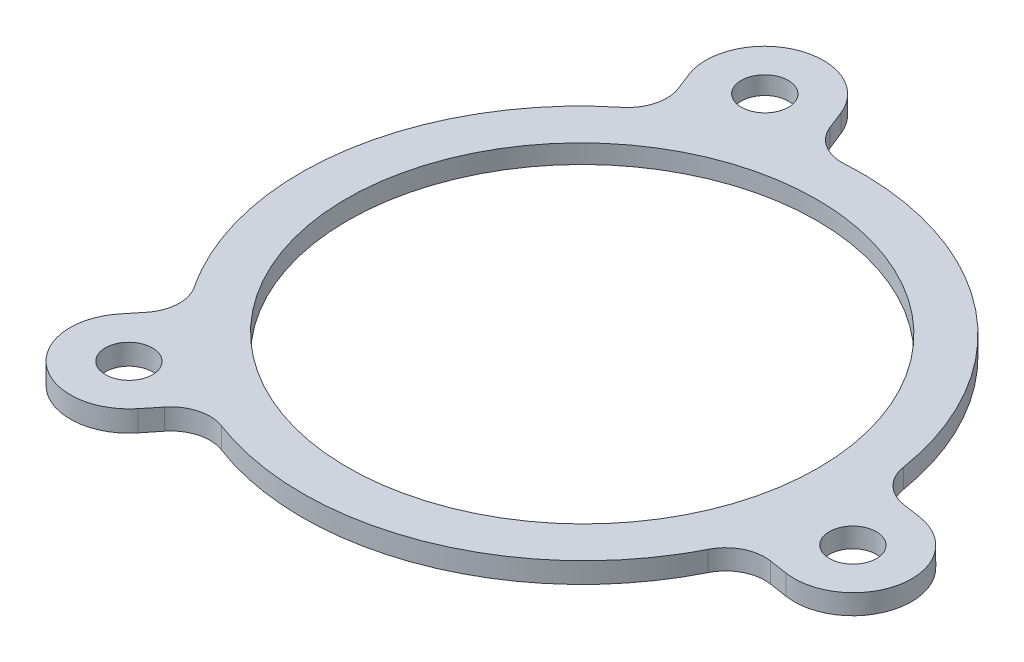
ISO-10303-21;
HEADER;
FILE_DESCRIPTION(('STEP AP214'),'2;1');
FILE_NAME('part.step','',(''),(''),'','','');
FILE_SCHEMA(('AUTOMOTIVE_DESIGN { 1 0 10303 214 1 1 1 1 }'));
ENDSEC;
DATA;
#1=APPLICATION_CONTEXT('core data for automotive mechanical design processes');
#2=APPLICATION_PROTOCOL_DEFINITION('international standard','automotive_design',2000,#1);
#3=PRODUCT_CONTEXT('',#1,'mechanical');
#4=PRODUCT('Part','Part','',(#3));
#5=PRODUCT_RELATED_PRODUCT_CATEGORY('part','',(#4));
#6=PRODUCT_DEFINITION_FORMATION('','',#4);
#7=PRODUCT_DEFINITION_CONTEXT('part definition',#1,'design');
#8=PRODUCT_DEFINITION('design','',#6,#7);
#9=PRODUCT_DEFINITION_SHAPE('','',#8);
#10=(LENGTH_UNIT() NAMED_UNIT(*) SI_UNIT(.MILLI.,.METRE.));
#11=(NAMED_UNIT(*) PLANE_ANGLE_UNIT() SI_UNIT($,.RADIAN.));
#12=(NAMED_UNIT(*) SI_UNIT($,.STERADIAN.) SOLID_ANGLE_UNIT());
#13=UNCERTAINTY_MEASURE_WITH_UNIT(LENGTH_MEASURE(1.E-05),#10,'distance_accuracy_value','');
#14=(GEOMETRIC_REPRESENTATION_CONTEXT(3) GLOBAL_UNCERTAINTY_ASSIGNED_CONTEXT((#13)) GLOBAL_UNIT_ASSIGNED_CONTEXT((#10,
#11,#12)) REPRESENTATION_CONTEXT('',''));
#15=CARTESIAN_POINT('',(0.,0.,0.));
#16=DIRECTION('',(0.,0.,1.));
#17=DIRECTION('',(1.,0.,0.));
#18=AXIS2_PLACEMENT_3D('',#15,#16,#17);
#19=CARTESIAN_POINT('',(-6.0204669415708,49.0014439556006,-15.3624209617317));
#20=DIRECTION('',(0.,-1.,0.));
#21=DIRECTION('',(0.,0.,-1.));
#22=AXIS2_PLACEMENT_3D('',#19,#20,#21);
#23=CYLINDRICAL_SURFACE('',#22,1.2);
#24=CARTESIAN_POINT('',(-6.0204669415708,0.,-15.3624209617317));
#25=DIRECTION('',(0.,1.,0.));
#26=DIRECTION('',(0.,0.,1.));
#27=AXIS2_PLACEMENT_3D('',#24,#25,#26);
#28=CIRCLE('',#27,1.2);
#29=CARTESIAN_POINT('',(-6.0204669415708,0.,-14.1624209617317));
#30=VERTEX_POINT('',#29);
#31=EDGE_CURVE('E740',#30,#30,#28,.T.);
#32=ORIENTED_EDGE('',*,*,#31,.F.);
#33=EDGE_LOOP('',(#32));
#34=FACE_BOUND('',#33,.T.);
#35=CARTESIAN_POINT('',(-6.0204669415708,0.922243136209582,-15.3624209617317));
#36=DIRECTION('',(0.,0.999987190864844,-0.0050614332197987));
#37=DIRECTION('',(0.,-0.0050614332197987,-0.999987190864844));
#38=AXIS2_PLACEMENT_3D('',#35,#36,#37);
#39=ELLIPSE('',#38,1.20001537115908,1.2);
#40=CARTESIAN_POINT('',(-6.0204669415708,0.916169338545728,-16.5624209617317));
#41=VERTEX_POINT('',#40);
#42=EDGE_CURVE('E194',#41,#41,#39,.T.);
#43=ORIENTED_EDGE('',*,*,#42,.T.);
#44=EDGE_LOOP('',(#43));
#45=FACE_BOUND('',#44,.T.);
#46=ADVANCED_FACE('F43',(#34,#45),#23,.F.);
#47=CARTESIAN_POINT('',(-3.22729949398321,49.0014439556006,-16.4570513147446));
#48=DIRECTION('',(-0.931055815862527,0.,0.364876784337624));
#49=DIRECTION('',(0.364876784337624,0.,0.931055815862527));
#50=AXIS2_PLACEMENT_3D('',#47,#48,#49);
#51=PLANE('',#50);
#52=DIRECTION('',(-0.364872732812042,-0.00471248487226164,-0.93104547758775));
#53=VECTOR('',#52,1.);
#54=CARTESIAN_POINT('',(-3.14461983774469,0.917770509358373,-16.2460776981739));
#55=LINE('',#54,#53);
#56=CARTESIAN_POINT('',(-2.87443070108355,0.921260115746203,-15.5566362815929));
#57=VERTEX_POINT('',#56);
#58=CARTESIAN_POINT('',(-3.22729949398321,0.916702666808822,-16.4570513147446));
#59=VERTEX_POINT('',#58);
#60=EDGE_CURVE('E173',#57,#59,#55,.T.);
#61=ORIENTED_EDGE('',*,*,#60,.F.);
#62=DIRECTION('',(0.,-1.,0.));
#63=VECTOR('',#62,1.);
#64=CARTESIAN_POINT('',(-2.87443070108355,49.0014439556006,-15.5566362815929));
#65=LINE('',#64,#63);
#66=CARTESIAN_POINT('',(-2.87443070108355,0.,-15.5566362815929));
#67=VERTEX_POINT('',#66);
#68=EDGE_CURVE('E60',#57,#67,#65,.T.);
#69=ORIENTED_EDGE('',*,*,#68,.T.);
#70=DIRECTION('',(-0.364876784337624,0.,-0.931055815862527));
#71=VECTOR('',#70,1.);
#72=CARTESIAN_POINT('',(-3.22729949398321,0.,-16.4570513147446));
#73=LINE('',#72,#71);
#74=CARTESIAN_POINT('',(-3.22729949398321,0.,-16.4570513147446));
#75=VERTEX_POINT('',#74);
#76=EDGE_CURVE('E176',#67,#75,#73,.T.);
#77=ORIENTED_EDGE('',*,*,#76,.T.);
#78=DIRECTION('',(0.,-1.,0.));
#79=VECTOR('',#78,1.);
#80=CARTESIAN_POINT('',(-3.22729949398321,49.0014439556006,-16.4570513147446));
#81=LINE('',#80,#79);
#82=EDGE_CURVE('E169',#59,#75,#81,.T.);
#83=ORIENTED_EDGE('',*,*,#82,.F.);
#84=EDGE_LOOP('',(#61,#69,#77,#83));
#85=FACE_BOUND('',#84,.T.);
#86=ADVANCED_FACE('F171',(#85),#51,.F.);
#87=CARTESIAN_POINT('',(-1.0123190693585,49.0014439556006,-16.2863898502682));
#88=DIRECTION('',(0.,-1.,0.));
#89=DIRECTION('',(0.,0.,-1.));
#90=AXIS2_PLACEMENT_3D('',#87,#88,#89);
#91=CYLINDRICAL_SURFACE('',#90,2.);
#92=CARTESIAN_POINT('',(-1.0123190693585,0.917566469479027,-16.2863898502682));
#93=DIRECTION('',(0.,0.999987190864844,-0.0050614332197987));
#94=DIRECTION('',(0.,-0.0050614332197987,-0.999987190864844));
#95=AXIS2_PLACEMENT_3D('',#92,#93,#94);
#96=ELLIPSE('',#95,2.00002561859846,2.);
#97=CARTESIAN_POINT('',(-0.888243794181388,0.927669966778247,-14.2902422289511));
#98=VERTEX_POINT('',#97);
#99=EDGE_CURVE('E188',#98,#57,#96,.F.);
#100=ORIENTED_EDGE('',*,*,#99,.F.);
#101=DIRECTION('',(0.,-1.,0.));
#102=VECTOR('',#101,1.);
#103=CARTESIAN_POINT('',(-0.888243794181388,49.0014439556006,-14.2902422289511));
#104=LINE('',#103,#102);
#105=CARTESIAN_POINT('',(-0.888243794181388,0.,-14.2902422289511));
#106=VERTEX_POINT('',#105);
#107=EDGE_CURVE('E296',#98,#106,#104,.T.);
#108=ORIENTED_EDGE('',*,*,#107,.T.);
#109=CARTESIAN_POINT('',(-1.0123190693585,0.,-16.2863898502682));
#110=DIRECTION('',(0.,-1.,0.));
#111=DIRECTION('',(0.,0.,-1.));
#112=AXIS2_PLACEMENT_3D('',#109,#110,#111);
#113=CIRCLE('',#112,2.);
#114=EDGE_CURVE('E291',#106,#67,#113,.T.);
#115=ORIENTED_EDGE('',*,*,#114,.T.);
#116=ORIENTED_EDGE('',*,*,#68,.F.);
#117=EDGE_LOOP('',(#100,#108,#115,#116));
#118=FACE_BOUND('',#117,.T.);
#119=ADVANCED_FACE('F423',(#118),#91,.F.);
#120=CARTESIAN_POINT('',(0.,49.0014439556006,0.));
#121=DIRECTION('',(0.,-1.,0.));
#122=DIRECTION('',(0.,0.,-1.));
#123=AXIS2_PLACEMENT_3D('',#120,#121,#122);
#124=CYLINDRICAL_SURFACE('',#123,14.3178210632764);
#125=CARTESIAN_POINT('',(0.,1.,0.));
#126=DIRECTION('',(0.,0.999987190864844,-0.0050614332197987));
#127=DIRECTION('',(0.,-0.0050614332197987,-0.999987190864844));
#128=AXIS2_PLACEMENT_3D('',#125,#126,#127);
#129=ELLIPSE('',#128,14.3180044645307,14.3178210632764);
#130=CARTESIAN_POINT('',(14.1319095605525,0.9883595094098,-2.29981133408054));
#131=VERTEX_POINT('',#130);
#132=EDGE_CURVE('E191',#131,#98,#129,.T.);
#133=ORIENTED_EDGE('',*,*,#132,.F.);
#134=DIRECTION('',(0.,-1.,0.));
#135=VECTOR('',#134,1.);
#136=CARTESIAN_POINT('',(14.1319095605525,49.0014439556006,-2.29981133408054));
#137=LINE('',#136,#135);
#138=CARTESIAN_POINT('',(14.1319095605525,0.,-2.29981133408054));
#139=VERTEX_POINT('',#138);
#140=EDGE_CURVE('E298',#131,#139,#137,.T.);
#141=ORIENTED_EDGE('',*,*,#140,.T.);
#142=CARTESIAN_POINT('',(0.,0.,0.));
#143=DIRECTION('',(0.,1.,0.));
#144=DIRECTION('',(0.,0.,-1.));
#145=AXIS2_PLACEMENT_3D('',#142,#143,#144);
#146=CIRCLE('',#145,14.3178210632764);
#147=EDGE_CURVE('E414',#139,#106,#146,.T.);
#148=ORIENTED_EDGE('',*,*,#147,.T.);
#149=ORIENTED_EDGE('',*,*,#107,.F.);
#150=EDGE_LOOP('',(#133,#141,#148,#149));
#151=FACE_BOUND('',#150,.T.);
#152=ADVANCED_FACE('F424',(#151),#124,.T.);
#153=CARTESIAN_POINT('',(16.1059403153856,49.0014439556006,-2.62106291613576));
#154=DIRECTION('',(0.,-1.,0.));
#155=DIRECTION('',(0.,0.,-1.));
#156=AXIS2_PLACEMENT_3D('',#153,#154,#155);
#157=CYLINDRICAL_SURFACE('',#156,2.);
#158=CARTESIAN_POINT('',(16.1059403153856,0.986733495152638,-2.62106291613576));
#159=DIRECTION('',(0.,0.999987190864844,-0.0050614332197987));
#160=DIRECTION('',(0.,-0.0050614332197987,-0.999987190864844));
#161=AXIS2_PLACEMENT_3D('',#158,#159,#160);
#162=ELLIPSE('',#161,2.00002561859847,2.);
#163=CARTESIAN_POINT('',(15.8068696284982,0.996742672148186,-0.643550154041748));
#164=VERTEX_POINT('',#163);
#165=EDGE_CURVE('E396',#164,#131,#162,.F.);
#166=ORIENTED_EDGE('',*,*,#165,.F.);
#167=DIRECTION('',(0.,-1.,0.));
#168=VECTOR('',#167,1.);
#169=CARTESIAN_POINT('',(15.8068696284982,49.0014439556006,-0.643550154041748));
#170=LINE('',#169,#168);
#171=CARTESIAN_POINT('',(15.8068696284982,0.,-0.643550154041748));
#172=VERTEX_POINT('',#171);
#173=EDGE_CURVE('E300',#164,#172,#170,.T.);
#174=ORIENTED_EDGE('',*,*,#173,.T.);
#175=CARTESIAN_POINT('',(16.1059403153856,0.,-2.62106291613576));
#176=DIRECTION('',(0.,-1.,0.));
#177=DIRECTION('',(0.,0.,-1.));
#178=AXIS2_PLACEMENT_3D('',#175,#176,#177);
#179=CIRCLE('',#178,2.);
#180=EDGE_CURVE('E413',#172,#139,#179,.T.);
#181=ORIENTED_EDGE('',*,*,#180,.T.);
#182=ORIENTED_EDGE('',*,*,#140,.F.);
#183=EDGE_LOOP('',(#166,#174,#181,#182));
#184=FACE_BOUND('',#183,.T.);
#185=ADVANCED_FACE('F425',(#184),#157,.F.);
#186=CARTESIAN_POINT('',(16.7630863176067,49.0014439556006,-0.498935976319788));
#187=DIRECTION('',(-0.149535343443711,0.,0.988756381047006));
#188=DIRECTION('',(0.988756381047006,0.,0.149535343443711));
#189=AXIS2_PLACEMENT_3D('',#186,#187,#188);
#190=PLANE('',#189);
#191=DIRECTION('',(-0.988756097839362,-0.000756872632936957,-0.149535300612582));
#192=VECTOR('',#191,1.);
#193=CARTESIAN_POINT('',(16.799010684789,0.99750213589779,-0.493502926594323));
#194=LINE('',#193,#192);
#195=CARTESIAN_POINT('',(16.7630863176067,0.997474636527179,-0.498935976319787));
#196=VERTEX_POINT('',#195);
#197=EDGE_CURVE('E387',#196,#164,#194,.T.);
#198=ORIENTED_EDGE('',*,*,#197,.F.);
#199=DIRECTION('',(0.,-1.,0.));
#200=VECTOR('',#199,1.);
#201=CARTESIAN_POINT('',(16.7630863176067,49.0014439556006,-0.498935976319787));
#202=LINE('',#201,#200);
#203=CARTESIAN_POINT('',(16.7630863176067,0.,-0.498935976319787));
#204=VERTEX_POINT('',#203);
#205=EDGE_CURVE('E302',#196,#204,#202,.T.);
#206=ORIENTED_EDGE('',*,*,#205,.T.);
#207=DIRECTION('',(-0.988756381047006,0.,-0.149535343443711));
#208=VECTOR('',#207,1.);
#209=CARTESIAN_POINT('',(16.7630863176067,0.,-0.498935976319788));
#210=LINE('',#209,#208);
#211=EDGE_CURVE('E247',#204,#172,#210,.T.);
#212=ORIENTED_EDGE('',*,*,#211,.T.);
#213=ORIENTED_EDGE('',*,*,#173,.F.);
#214=EDGE_LOOP('',(#198,#206,#212,#213));
#215=FACE_BOUND('',#214,.T.);
#216=ADVANCED_FACE('F402',(#215),#190,.F.);
#217=CARTESIAN_POINT('',(16.3144802872756,49.0014439556006,2.46733316682123));
#218=DIRECTION('',(0.,-1.,0.));
#219=DIRECTION('',(0.,0.,-1.));
#220=AXIS2_PLACEMENT_3D('',#217,#218,#219);
#221=CYLINDRICAL_SURFACE('',#220,3.);
#222=CARTESIAN_POINT('',(16.3144802872756,1.01248840202049,2.46733316682123));
#223=DIRECTION('',(0.,0.999987190864844,-0.0050614332197987));
#224=DIRECTION('',(0.,-0.0050614332197987,-0.999987190864844));
#225=AXIS2_PLACEMENT_3D('',#222,#223,#224);
#226=ELLIPSE('',#225,3.0000384278977,3.);
#227=CARTESIAN_POINT('',(15.8658742569445,1.0275021675138,5.43360230996224));
#228=VERTEX_POINT('',#227);
#229=EDGE_CURVE('E383',#228,#196,#226,.T.);
#230=ORIENTED_EDGE('',*,*,#229,.F.);
#231=DIRECTION('',(0.,-1.,0.));
#232=VECTOR('',#231,1.);
#233=CARTESIAN_POINT('',(15.8658742569445,49.0014439556006,5.43360230996224));
#234=LINE('',#233,#232);
#235=CARTESIAN_POINT('',(15.8658742569445,0.,5.43360230996224));
#236=VERTEX_POINT('',#235);
#237=EDGE_CURVE('E304',#228,#236,#234,.T.);
#238=ORIENTED_EDGE('',*,*,#237,.T.);
#239=CARTESIAN_POINT('',(16.3144802872756,0.,2.46733316682123));
#240=DIRECTION('',(0.,1.,0.));
#241=DIRECTION('',(0.,0.,-1.));
#242=AXIS2_PLACEMENT_3D('',#239,#240,#241);
#243=CIRCLE('',#242,3.);
#244=EDGE_CURVE('E243',#236,#204,#243,.T.);
#245=ORIENTED_EDGE('',*,*,#244,.T.);
#246=ORIENTED_EDGE('',*,*,#205,.F.);
#247=EDGE_LOOP('',(#230,#238,#245,#246));
#248=FACE_BOUND('',#247,.T.);
#249=ADVANCED_FACE('F405',(#248),#221,.T.);
#250=CARTESIAN_POINT('',(15.8658742569445,49.0014439556006,5.43360230996224));
#251=DIRECTION('',(0.149535343443709,0.,-0.988756381047006));
#252=DIRECTION('',(-0.988756381047006,0.,-0.149535343443709));
#253=AXIS2_PLACEMENT_3D('',#250,#251,#252);
#254=PLANE('',#253);
#255=DIRECTION('',(0.988756097839362,0.000756872632936951,0.14953530061258));
#256=VECTOR('',#255,1.);
#257=CARTESIAN_POINT('',(15.9017761526506,1.02752964968295,5.43903196119647));
#258=LINE('',#257,#256);
#259=CARTESIAN_POINT('',(14.9096575678359,1.02677020313479,5.28898813224028));
#260=VERTEX_POINT('',#259);
#261=EDGE_CURVE('E378',#260,#228,#258,.T.);
#262=ORIENTED_EDGE('',*,*,#261,.F.);
#263=DIRECTION('',(0.,-1.,0.));
#264=VECTOR('',#263,1.);
#265=CARTESIAN_POINT('',(14.9096575678359,49.0014439556006,5.28898813224028));
#266=LINE('',#265,#264);
#267=CARTESIAN_POINT('',(14.9096575678359,0.,5.28898813224028));
#268=VERTEX_POINT('',#267);
#269=EDGE_CURVE('E306',#260,#268,#266,.T.);
#270=ORIENTED_EDGE('',*,*,#269,.T.);
#271=DIRECTION('',(0.988756381047006,0.,0.149535343443709));
#272=VECTOR('',#271,1.);
#273=CARTESIAN_POINT('',(15.8658742569445,0.,5.43360230996224));
#274=LINE('',#273,#272);
#275=EDGE_CURVE('E239',#268,#236,#274,.T.);
#276=ORIENTED_EDGE('',*,*,#275,.T.);
#277=ORIENTED_EDGE('',*,*,#237,.F.);
#278=EDGE_LOOP('',(#262,#270,#276,#277));
#279=FACE_BOUND('',#278,.T.);
#280=ADVANCED_FACE('F487',(#279),#254,.F.);
#281=CARTESIAN_POINT('',(14.6105868809485,49.0014439556006,7.2665008943343));
#282=DIRECTION('',(0.,-1.,0.));
#283=DIRECTION('',(0.,0.,-1.));
#284=AXIS2_PLACEMENT_3D('',#281,#282,#283);
#285=CYLINDRICAL_SURFACE('',#284,2.);
#286=CARTESIAN_POINT('',(14.6105868809485,1.03677938013033,7.2665008943343));
#287=DIRECTION('',(0.,0.999987190864844,-0.0050614332197987));
#288=DIRECTION('',(0.,-0.0050614332197987,-0.999987190864844));
#289=AXIS2_PLACEMENT_3D('',#286,#287,#288);
#290=ELLIPSE('',#289,2.00002561859846,2.);
#291=CARTESIAN_POINT('',(12.8198346935955,1.03227150129189,6.37587942396069));
#292=VERTEX_POINT('',#291);
#293=EDGE_CURVE('E376',#292,#260,#290,.F.);
#294=ORIENTED_EDGE('',*,*,#293,.F.);
#295=DIRECTION('',(0.,-1.,0.));
#296=VECTOR('',#295,1.);
#297=CARTESIAN_POINT('',(12.8198346935955,49.0014439556006,6.37587942396069));
#298=LINE('',#297,#296);
#299=CARTESIAN_POINT('',(12.8198346935955,0.,6.37587942396069));
#300=VERTEX_POINT('',#299);
#301=EDGE_CURVE('E308',#292,#300,#298,.T.);
#302=ORIENTED_EDGE('',*,*,#301,.T.);
#303=CARTESIAN_POINT('',(14.6105868809485,0.,7.2665008943343));
#304=DIRECTION('',(0.,-1.,0.));
#305=DIRECTION('',(0.,0.,-1.));
#306=AXIS2_PLACEMENT_3D('',#303,#304,#305);
#307=CIRCLE('',#306,2.);
#308=EDGE_CURVE('E236',#300,#268,#307,.T.);
#309=ORIENTED_EDGE('',*,*,#308,.T.);
#310=ORIENTED_EDGE('',*,*,#269,.F.);
#311=EDGE_LOOP('',(#294,#302,#309,#310));
#312=FACE_BOUND('',#311,.T.);
#313=ADVANCED_FACE('F481',(#312),#285,.F.);
#314=CARTESIAN_POINT('',(0.,49.0014439556006,0.));
#315=DIRECTION('',(0.,-1.,0.));
#316=DIRECTION('',(0.,0.,-1.));
#317=AXIS2_PLACEMENT_3D('',#314,#315,#316);
#318=CYLINDRICAL_SURFACE('',#317,14.3178210632764);
#319=CARTESIAN_POINT('',(0.,1.,0.));
#320=DIRECTION('',(0.,0.999987190864844,-0.0050614332197987));
#321=DIRECTION('',(0.,-0.0050614332197987,-0.999987190864844));
#322=AXIS2_PLACEMENT_3D('',#319,#320,#321);
#323=ELLIPSE('',#322,14.3180044645307,14.3178210632764);
#324=CARTESIAN_POINT('',(-5.07425974105116,1.06776585833629,13.3884983504629));
#325=VERTEX_POINT('',#324);
#326=EDGE_CURVE('E372',#325,#292,#323,.T.);
#327=ORIENTED_EDGE('',*,*,#326,.F.);
#328=DIRECTION('',(0.,-1.,0.));
#329=VECTOR('',#328,1.);
#330=CARTESIAN_POINT('',(-5.07425974105116,49.0014439556006,13.3884983504629));
#331=LINE('',#330,#329);
#332=CARTESIAN_POINT('',(-5.07425974105116,0.,13.3884983504629));
#333=VERTEX_POINT('',#332);
#334=EDGE_CURVE('E310',#325,#333,#331,.T.);
#335=ORIENTED_EDGE('',*,*,#334,.T.);
#336=CARTESIAN_POINT('',(0.,0.,0.));
#337=DIRECTION('',(0.,1.,0.));
#338=DIRECTION('',(0.,0.,-1.));
#339=AXIS2_PLACEMENT_3D('',#336,#337,#338);
#340=CIRCLE('',#339,14.3178210632764);
#341=EDGE_CURVE('E233',#333,#300,#340,.T.);
#342=ORIENTED_EDGE('',*,*,#341,.T.);
#343=ORIENTED_EDGE('',*,*,#301,.F.);
#344=EDGE_LOOP('',(#327,#335,#342,#343));
#345=FACE_BOUND('',#344,.T.);
#346=ADVANCED_FACE('F486',(#345),#318,.T.);
#347=CARTESIAN_POINT('',(-5.78306308740197,49.0014439556006,15.2586849230277));
#348=DIRECTION('',(0.,-1.,0.));
#349=DIRECTION('',(0.,0.,-1.));
#350=AXIS2_PLACEMENT_3D('',#347,#348,#349);
#351=CYLINDRICAL_SURFACE('',#350,2.);
#352=CARTESIAN_POINT('',(-5.78306308740197,1.07723180403247,15.2586849230277));
#353=DIRECTION('',(0.,0.999987190864844,-0.0050614332197987));
#354=DIRECTION('',(0.,-0.0050614332197987,-0.999987190864844));
#355=AXIS2_PLACEMENT_3D('',#352,#353,#354);
#356=ELLIPSE('',#355,2.00002561859846,2.);
#357=CARTESIAN_POINT('',(-7.3461040322396,1.07091627330411,14.010925729609));
#358=VERTEX_POINT('',#357);
#359=EDGE_CURVE('E366',#358,#325,#356,.F.);
#360=ORIENTED_EDGE('',*,*,#359,.F.);
#361=DIRECTION('',(0.,-1.,0.));
#362=VECTOR('',#361,1.);
#363=CARTESIAN_POINT('',(-7.3461040322396,49.0014439556006,14.010925729609));
#364=LINE('',#363,#362);
#365=CARTESIAN_POINT('',(-7.3461040322396,0.,14.010925729609));
#366=VERTEX_POINT('',#365);
#367=EDGE_CURVE('E312',#358,#366,#364,.T.);
#368=ORIENTED_EDGE('',*,*,#367,.T.);
#369=CARTESIAN_POINT('',(-5.78306308740197,0.,15.2586849230277));
#370=DIRECTION('',(0.,-1.,0.));
#371=DIRECTION('',(0.,0.,-1.));
#372=AXIS2_PLACEMENT_3D('',#369,#370,#371);
#373=CIRCLE('',#372,2.);
#374=EDGE_CURVE('E226',#366,#333,#373,.T.);
#375=ORIENTED_EDGE('',*,*,#374,.T.);
#376=ORIENTED_EDGE('',*,*,#334,.F.);
#377=EDGE_LOOP('',(#360,#368,#375,#376));
#378=FACE_BOUND('',#377,.T.);
#379=ADVANCED_FACE('F499',(#378),#351,.F.);
#380=CARTESIAN_POINT('',(-7.94945192844849,49.0014439556006,14.7667265850386));
#381=DIRECTION('',(-0.781520472418816,0.,-0.62387959670939));
#382=DIRECTION('',(-0.62387959670939,0.,0.781520472418816));
#383=AXIS2_PLACEMENT_3D('',#380,#381,#382);
#384=PLANE('',#383);
#385=DIRECTION('',(0.623874715757163,-0.00395563340236112,-0.781514358155566));
#386=VECTOR('',#385,1.);
#387=CARTESIAN_POINT('',(-8.0677263865885,1.07549166867861,14.9148864397417));
#388=LINE('',#387,#386);
#389=CARTESIAN_POINT('',(-7.94945192844849,1.07474175786246,14.7667265850386));
#390=VERTEX_POINT('',#389);
#391=EDGE_CURVE('E361',#390,#358,#388,.T.);
#392=ORIENTED_EDGE('',*,*,#391,.F.);
#393=DIRECTION('',(0.,-1.,0.));
#394=VECTOR('',#393,1.);
#395=CARTESIAN_POINT('',(-7.94945192844849,49.0014439556006,14.7667265850386));
#396=LINE('',#395,#394);
#397=CARTESIAN_POINT('',(-7.94945192844849,0.,14.7667265850386));
#398=VERTEX_POINT('',#397);
#399=EDGE_CURVE('E314',#390,#398,#396,.T.);
#400=ORIENTED_EDGE('',*,*,#399,.T.);
#401=DIRECTION('',(0.62387959670939,0.,-0.781520472418816));
#402=VECTOR('',#401,1.);
#403=CARTESIAN_POINT('',(-7.94945192844849,0.,14.7667265850386));
#404=LINE('',#403,#402);
#405=EDGE_CURVE('E221',#398,#366,#404,.T.);
#406=ORIENTED_EDGE('',*,*,#405,.T.);
#407=ORIENTED_EDGE('',*,*,#367,.F.);
#408=EDGE_LOOP('',(#392,#400,#406,#407));
#409=FACE_BOUND('',#408,.T.);
#410=ADVANCED_FACE('F509',(#409),#384,.F.);
#411=CARTESIAN_POINT('',(-10.2940133457049,49.0014439556006,12.8950877949105));
#412=DIRECTION('',(0.,-1.,0.));
#413=DIRECTION('',(0.,0.,-1.));
#414=AXIS2_PLACEMENT_3D('',#411,#412,#413);
#415=CYLINDRICAL_SURFACE('',#414,3.);
#416=CARTESIAN_POINT('',(-10.2940133457049,1.06526846176993,12.8950877949105));
#417=DIRECTION('',(0.,0.999987190864844,-0.0050614332197987));
#418=DIRECTION('',(0.,-0.0050614332197987,-0.999987190864844));
#419=AXIS2_PLACEMENT_3D('',#416,#417,#418);
#420=ELLIPSE('',#419,3.0000384278977,3.);
#421=CARTESIAN_POINT('',(-12.6385747629614,1.05579516567738,11.0234490047823));
#422=VERTEX_POINT('',#421);
#423=EDGE_CURVE('E357',#422,#390,#420,.T.);
#424=ORIENTED_EDGE('',*,*,#423,.F.);
#425=DIRECTION('',(0.,-1.,0.));
#426=VECTOR('',#425,1.);
#427=CARTESIAN_POINT('',(-12.6385747629614,49.0014439556006,11.0234490047823));
#428=LINE('',#427,#426);
#429=CARTESIAN_POINT('',(-12.6385747629614,0.,11.0234490047823));
#430=VERTEX_POINT('',#429);
#431=EDGE_CURVE('E316',#422,#430,#428,.T.);
#432=ORIENTED_EDGE('',*,*,#431,.T.);
#433=CARTESIAN_POINT('',(-10.2940133457049,0.,12.8950877949105));
#434=DIRECTION('',(0.,1.,0.));
#435=DIRECTION('',(0.,0.,-1.));
#436=AXIS2_PLACEMENT_3D('',#433,#434,#435);
#437=CIRCLE('',#436,3.);
#438=EDGE_CURVE('E227',#430,#398,#437,.T.);
#439=ORIENTED_EDGE('',*,*,#438,.T.);
#440=ORIENTED_EDGE('',*,*,#399,.F.);
#441=EDGE_LOOP('',(#424,#432,#439,#440));
#442=FACE_BOUND('',#441,.T.);
#443=ADVANCED_FACE('F602',(#442),#415,.T.);
#444=CARTESIAN_POINT('',(-12.6385747629614,49.0014439556006,11.0234490047823));
#445=DIRECTION('',(0.781520472418816,0.,0.623879596709389));
#446=DIRECTION('',(0.623879596709389,0.,-0.781520472418816));
#447=AXIS2_PLACEMENT_3D('',#444,#445,#446);
#448=PLANE('',#447);
#449=DIRECTION('',(-0.623874715757162,0.00395563340236112,0.781514358155566));
#450=VECTOR('',#449,1.);
#451=CARTESIAN_POINT('',(-12.7568959778742,1.05654537295152,11.171667430683));
#452=LINE('',#451,#450);
#453=CARTESIAN_POINT('',(-12.0352268667525,1.05196968111901,10.2676481493526));
#454=VERTEX_POINT('',#453);
#455=EDGE_CURVE('E353',#454,#422,#452,.T.);
#456=ORIENTED_EDGE('',*,*,#455,.F.);
#457=DIRECTION('',(0.,-1.,0.));
#458=VECTOR('',#457,1.);
#459=CARTESIAN_POINT('',(-12.0352268667525,49.0014439556006,10.2676481493526));
#460=LINE('',#459,#458);
#461=CARTESIAN_POINT('',(-12.0352268667525,0.,10.2676481493526));
#462=VERTEX_POINT('',#461);
#463=EDGE_CURVE('E318',#454,#462,#460,.T.);
#464=ORIENTED_EDGE('',*,*,#463,.T.);
#465=DIRECTION('',(-0.623879596709389,0.,0.781520472418816));
#466=VECTOR('',#465,1.);
#467=CARTESIAN_POINT('',(-12.6385747629614,0.,11.0234490047823));
#468=LINE('',#467,#466);
#469=EDGE_CURVE('E258',#462,#430,#468,.T.);
#470=ORIENTED_EDGE('',*,*,#469,.T.);
#471=ORIENTED_EDGE('',*,*,#431,.F.);
#472=EDGE_LOOP('',(#456,#464,#470,#471));
#473=FACE_BOUND('',#472,.T.);
#474=ADVANCED_FACE('F522',(#473),#448,.F.);
#475=CARTESIAN_POINT('',(-13.5982678115901,49.0014439556006,9.01988895593385));
#476=DIRECTION('',(0.,-1.,0.));
#477=DIRECTION('',(0.,0.,-1.));
#478=AXIS2_PLACEMENT_3D('',#475,#476,#477);
#479=CYLINDRICAL_SURFACE('',#478,2.);
#480=CARTESIAN_POINT('',(-13.5982678115901,1.04565415039064,9.01988895593385));
#481=DIRECTION('',(0.,0.999987190864844,-0.0050614332197987));
#482=DIRECTION('',(0.,-0.0050614332197987,-0.999987190864844));
#483=AXIS2_PLACEMENT_3D('',#480,#481,#482);
#484=ELLIPSE('',#483,2.00002561859846,2.);
#485=CARTESIAN_POINT('',(-11.9315908994142,1.04005853192986,7.91436280499041));
#486=VERTEX_POINT('',#485);
#487=EDGE_CURVE('E344',#486,#454,#484,.F.);
#488=ORIENTED_EDGE('',*,*,#487,.F.);
#489=DIRECTION('',(0.,-1.,0.));
#490=VECTOR('',#489,1.);
#491=CARTESIAN_POINT('',(-11.9315908994142,49.0014439556006,7.91436280499041));
#492=LINE('',#491,#490);
#493=CARTESIAN_POINT('',(-11.9315908994142,0.,7.91436280499041));
#494=VERTEX_POINT('',#493);
#495=EDGE_CURVE('E320',#486,#494,#492,.T.);
#496=ORIENTED_EDGE('',*,*,#495,.T.);
#497=CARTESIAN_POINT('',(-13.5982678115901,0.,9.01988895593385));
#498=DIRECTION('',(0.,-1.,0.));
#499=DIRECTION('',(0.,0.,-1.));
#500=AXIS2_PLACEMENT_3D('',#497,#498,#499);
#501=CIRCLE('',#500,2.);
#502=EDGE_CURVE('E262',#494,#462,#501,.T.);
#503=ORIENTED_EDGE('',*,*,#502,.T.);
#504=ORIENTED_EDGE('',*,*,#463,.F.);
#505=EDGE_LOOP('',(#488,#496,#503,#504));
#506=FACE_BOUND('',#505,.T.);
#507=ADVANCED_FACE('F517',(#506),#479,.F.);
#508=CARTESIAN_POINT('',(0.,49.0014439556006,0.));
#509=DIRECTION('',(0.,-1.,0.));
#510=DIRECTION('',(0.,0.,-1.));
#511=AXIS2_PLACEMENT_3D('',#508,#509,#510);
#512=CYLINDRICAL_SURFACE('',#511,14.3178210632764);
#513=CARTESIAN_POINT('',(0.,1.,0.));
#514=DIRECTION('',(0.,0.999987190864844,-0.0050614332197987));
#515=DIRECTION('',(0.,-0.0050614332197987,-0.999987190864844));
#516=AXIS2_PLACEMENT_3D('',#513,#514,#515);
#517=ELLIPSE('',#516,14.3180044645307,14.3178210632764);
#518=CARTESIAN_POINT('',(-9.05764981950144,0.943874632253913,-11.0886870163823));
#519=VERTEX_POINT('',#518);
#520=EDGE_CURVE('E342',#519,#486,#517,.T.);
#521=ORIENTED_EDGE('',*,*,#520,.F.);
#522=DIRECTION('',(0.,-1.,0.));
#523=VECTOR('',#522,1.);
#524=CARTESIAN_POINT('',(-9.05764981950144,49.0014439556006,-11.0886870163823));
#525=LINE('',#524,#523);
#526=CARTESIAN_POINT('',(-9.05764981950144,0.,-11.0886870163823));
#527=VERTEX_POINT('',#526);
#528=EDGE_CURVE('E322',#519,#527,#525,.T.);
#529=ORIENTED_EDGE('',*,*,#528,.T.);
#530=CARTESIAN_POINT('',(0.,0.,0.));
#531=DIRECTION('',(0.,1.,0.));
#532=DIRECTION('',(0.,0.,-1.));
#533=AXIS2_PLACEMENT_3D('',#530,#531,#532);
#534=CIRCLE('',#533,14.3178210632764);
#535=EDGE_CURVE('E266',#527,#494,#534,.T.);
#536=ORIENTED_EDGE('',*,*,#535,.T.);
#537=ORIENTED_EDGE('',*,*,#495,.F.);
#538=EDGE_LOOP('',(#521,#529,#536,#537));
#539=FACE_BOUND('',#538,.T.);
#540=ADVANCED_FACE('F340',(#539),#512,.T.);
#541=CARTESIAN_POINT('',(-10.3228772279838,49.0014439556006,-12.6376220068919));
#542=DIRECTION('',(0.,-1.,0.));
#543=DIRECTION('',(0.,0.,-1.));
#544=AXIS2_PLACEMENT_3D('',#541,#542,#543);
#545=CYLINDRICAL_SURFACE('',#544,2.);
#546=CARTESIAN_POINT('',(-10.3228772279838,0.936034700814901,-12.6376220068919));
#547=DIRECTION('',(0.,0.999987190864844,-0.0050614332197987));
#548=DIRECTION('',(0.,-0.0050614332197987,-0.999987190864844));
#549=AXIS2_PLACEMENT_3D('',#546,#547,#548);
#550=ELLIPSE('',#549,2.00002561859846,2.);
#551=CARTESIAN_POINT('',(-8.46076559625871,0.932341054547731,-13.3673755755672));
#552=VERTEX_POINT('',#551);
#553=EDGE_CURVE('E330',#552,#519,#550,.F.);
#554=ORIENTED_EDGE('',*,*,#553,.F.);
#555=DIRECTION('',(0.,-1.,0.));
#556=VECTOR('',#555,1.);
#557=CARTESIAN_POINT('',(-8.46076559625871,49.0014439556006,-13.3673755755672));
#558=LINE('',#557,#556);
#559=CARTESIAN_POINT('',(-8.46076559625871,0.,-13.3673755755672));
#560=VERTEX_POINT('',#559);
#561=EDGE_CURVE('E53',#552,#560,#558,.T.);
#562=ORIENTED_EDGE('',*,*,#561,.T.);
#563=CARTESIAN_POINT('',(-10.3228772279838,0.,-12.6376220068919));
#564=DIRECTION('',(0.,-1.,0.));
#565=DIRECTION('',(0.,0.,1.));
#566=AXIS2_PLACEMENT_3D('',#563,#564,#565);
#567=CIRCLE('',#566,2.);
#568=EDGE_CURVE('E270',#560,#527,#567,.T.);
#569=ORIENTED_EDGE('',*,*,#568,.T.);
#570=ORIENTED_EDGE('',*,*,#528,.F.);
#571=EDGE_LOOP('',(#554,#562,#569,#570));
#572=FACE_BOUND('',#571,.T.);
#573=ADVANCED_FACE('F325',(#572),#545,.F.);
#574=CARTESIAN_POINT('',(-8.81363438915838,49.0014439556006,-14.2677906087188));
#575=DIRECTION('',(0.931055815862527,0.,-0.364876784337623));
#576=DIRECTION('',(-0.364876784337623,0.,-0.931055815862527));
#577=AXIS2_PLACEMENT_3D('',#574,#575,#576);
#578=PLANE('',#577);
#579=DIRECTION('',(0.364872732812041,0.00471248487226164,0.93104547758775));
#580=VECTOR('',#579,1.);
#581=CARTESIAN_POINT('',(-8.73097378612023,0.928851202079799,-14.0568656101852));
#582=LINE('',#581,#580);
#583=CARTESIAN_POINT('',(-8.81363438915838,0.927783605610355,-14.2677906087188));
#584=VERTEX_POINT('',#583);
#585=EDGE_CURVE('E67',#584,#552,#582,.T.);
#586=ORIENTED_EDGE('',*,*,#585,.F.);
#587=DIRECTION('',(0.,-1.,0.));
#588=VECTOR('',#587,1.);
#589=CARTESIAN_POINT('',(-8.81363438915838,49.0014439556006,-14.2677906087188));
#590=LINE('',#589,#588);
#591=CARTESIAN_POINT('',(-8.81363438915838,0.,-14.2677906087188));
#592=VERTEX_POINT('',#591);
#593=EDGE_CURVE('E12',#584,#592,#590,.T.);
#594=ORIENTED_EDGE('',*,*,#593,.T.);
#595=DIRECTION('',(0.364876784337623,0.,0.931055815862527));
#596=VECTOR('',#595,1.);
#597=CARTESIAN_POINT('',(-8.81363438915838,0.,-14.2677906087188));
#598=LINE('',#597,#596);
#599=EDGE_CURVE('E274',#592,#560,#598,.T.);
#600=ORIENTED_EDGE('',*,*,#599,.T.);
#601=ORIENTED_EDGE('',*,*,#561,.F.);
#602=EDGE_LOOP('',(#586,#594,#600,#601));
#603=FACE_BOUND('',#602,.T.);
#604=ADVANCED_FACE('F332',(#603),#578,.F.);
#605=CARTESIAN_POINT('',(-6.0204669415708,49.0014439556006,-15.3624209617317));
#606=DIRECTION('',(0.,-1.,0.));
#607=DIRECTION('',(0.,0.,-1.));
#608=AXIS2_PLACEMENT_3D('',#605,#606,#607);
#609=CYLINDRICAL_SURFACE('',#608,3.);
#610=CARTESIAN_POINT('',(-6.0204669415708,0.922243136209582,-15.3624209617317));
#611=DIRECTION('',(0.,0.999987190864844,-0.0050614332197987));
#612=DIRECTION('',(0.,-0.0050614332197987,-0.999987190864844));
#613=AXIS2_PLACEMENT_3D('',#610,#611,#612);
#614=ELLIPSE('',#613,3.0000384278977,3.);
#615=EDGE_CURVE('E182',#59,#584,#614,.T.);
#616=ORIENTED_EDGE('',*,*,#615,.F.);
#617=ORIENTED_EDGE('',*,*,#82,.T.);
#618=CARTESIAN_POINT('',(-6.0204669415708,0.,-15.3624209617317));
#619=DIRECTION('',(0.,1.,0.));
#620=DIRECTION('',(0.,0.,-1.));
#621=AXIS2_PLACEMENT_3D('',#618,#619,#620);
#622=CIRCLE('',#621,3.);
#623=EDGE_CURVE('E277',#75,#592,#622,.T.);
#624=ORIENTED_EDGE('',*,*,#623,.T.);
#625=ORIENTED_EDGE('',*,*,#593,.F.);
#626=EDGE_LOOP('',(#616,#617,#624,#625));
#627=FACE_BOUND('',#626,.T.);
#628=ADVANCED_FACE('F45',(#627),#609,.T.);
#629=CARTESIAN_POINT('',(0.,49.0014439556006,0.));
#630=DIRECTION('',(0.,-1.,0.));
#631=DIRECTION('',(0.,0.,-1.));
#632=AXIS2_PLACEMENT_3D('',#629,#630,#631);
#633=CYLINDRICAL_SURFACE('',#632,12.);
#634=CARTESIAN_POINT('',(0.,0.,0.));
#635=DIRECTION('',(0.,1.,0.));
#636=DIRECTION('',(0.,0.,1.));
#637=AXIS2_PLACEMENT_3D('',#634,#635,#636);
#638=CIRCLE('',#637,12.);
#639=CARTESIAN_POINT('',(0.,0.,12.));
#640=VERTEX_POINT('',#639);
#641=EDGE_CURVE('E280',#640,#640,#638,.T.);
#642=ORIENTED_EDGE('',*,*,#641,.F.);
#643=EDGE_LOOP('',(#642));
#644=FACE_BOUND('',#643,.T.);
#645=CARTESIAN_POINT('',(0.,1.,0.));
#646=DIRECTION('',(0.,0.999987190864844,-0.0050614332197987));
#647=DIRECTION('',(0.,-0.0050614332197987,-0.999987190864844));
#648=AXIS2_PLACEMENT_3D('',#645,#646,#647);
#649=ELLIPSE('',#648,12.0001537115908,12.);
#650=CARTESIAN_POINT('',(0.,0.939262023361464,-12.));
#651=VERTEX_POINT('',#650);
#652=EDGE_CURVE('E189',#651,#651,#649,.T.);
#653=ORIENTED_EDGE('',*,*,#652,.T.);
#654=EDGE_LOOP('',(#653));
#655=FACE_BOUND('',#654,.T.);
#656=ADVANCED_FACE('F447',(#644,#655),#633,.F.);
#657=CARTESIAN_POINT('',(16.3144802872756,49.0014439556006,2.46733316682123));
#658=DIRECTION('',(0.,-1.,0.));
#659=DIRECTION('',(0.,0.,-1.));
#660=AXIS2_PLACEMENT_3D('',#657,#658,#659);
#661=CYLINDRICAL_SURFACE('',#660,1.2);
#662=CARTESIAN_POINT('',(16.3144802872756,0.,2.46733316682123));
#663=DIRECTION('',(0.,1.,0.));
#664=DIRECTION('',(0.,0.,1.));
#665=AXIS2_PLACEMENT_3D('',#662,#663,#664);
#666=CIRCLE('',#665,1.2);
#667=CARTESIAN_POINT('',(16.3144802872756,0.,3.66733316682123));
#668=VERTEX_POINT('',#667);
#669=EDGE_CURVE('E214',#668,#668,#666,.T.);
#670=ORIENTED_EDGE('',*,*,#669,.F.);
#671=EDGE_LOOP('',(#670));
#672=FACE_BOUND('',#671,.T.);
#673=CARTESIAN_POINT('',(16.3144802872756,1.01248840202049,2.46733316682123));
#674=DIRECTION('',(0.,0.999987190864844,-0.0050614332197987));
#675=DIRECTION('',(0.,-0.0050614332197987,-0.999987190864844));
#676=AXIS2_PLACEMENT_3D('',#673,#674,#675);
#677=ELLIPSE('',#676,1.20001537115908,1.2);
#678=CARTESIAN_POINT('',(16.3144802872756,1.00641460435664,1.26733316682123));
#679=VERTEX_POINT('',#678);
#680=EDGE_CURVE('E724',#679,#679,#677,.T.);
#681=ORIENTED_EDGE('',*,*,#680,.T.);
#682=EDGE_LOOP('',(#681));
#683=FACE_BOUND('',#682,.T.);
#684=ADVANCED_FACE('F445',(#672,#683),#661,.F.);
#685=CARTESIAN_POINT('',(-6.0204669415708,0.,-15.3624209617317));
#686=DIRECTION('',(0.,-1.,0.));
#687=DIRECTION('',(0.,0.,-1.));
#688=AXIS2_PLACEMENT_3D('',#685,#686,#687);
#689=PLANE('',#688);
#690=ORIENTED_EDGE('',*,*,#669,.T.);
#691=EDGE_LOOP('',(#690));
#692=FACE_BOUND('',#691,.T.);
#693=ORIENTED_EDGE('',*,*,#641,.T.);
#694=EDGE_LOOP('',(#693));
#695=FACE_BOUND('',#694,.T.);
#696=ORIENTED_EDGE('',*,*,#623,.F.);
#697=ORIENTED_EDGE('',*,*,#76,.F.);
#698=ORIENTED_EDGE('',*,*,#114,.F.);
#699=ORIENTED_EDGE('',*,*,#147,.F.);
#700=ORIENTED_EDGE('',*,*,#180,.F.);
#701=ORIENTED_EDGE('',*,*,#211,.F.);
#702=ORIENTED_EDGE('',*,*,#244,.F.);
#703=ORIENTED_EDGE('',*,*,#275,.F.);
#704=ORIENTED_EDGE('',*,*,#308,.F.);
#705=ORIENTED_EDGE('',*,*,#341,.F.);
#706=ORIENTED_EDGE('',*,*,#374,.F.);
#707=ORIENTED_EDGE('',*,*,#405,.F.);
#708=ORIENTED_EDGE('',*,*,#438,.F.);
#709=ORIENTED_EDGE('',*,*,#469,.F.);
#710=ORIENTED_EDGE('',*,*,#502,.F.);
#711=ORIENTED_EDGE('',*,*,#535,.F.);
#712=ORIENTED_EDGE('',*,*,#568,.F.);
#713=ORIENTED_EDGE('',*,*,#599,.F.);
#714=EDGE_LOOP('',(#696,#697,#698,#699,#700,#701,#702,#703,#704,#705,#706,#707,#708,#709,#710,
#711,#712,#713));
#715=FACE_BOUND('',#714,.T.);
#716=ORIENTED_EDGE('',*,*,#31,.T.);
#717=EDGE_LOOP('',(#716));
#718=FACE_BOUND('',#717,.T.);
#719=CARTESIAN_POINT('',(-10.2940133457049,0.,12.8950877949105));
#720=DIRECTION('',(0.,1.,0.));
#721=DIRECTION('',(0.,0.,1.));
#722=AXIS2_PLACEMENT_3D('',#719,#720,#721);
#723=CIRCLE('',#722,1.2);
#724=CARTESIAN_POINT('',(-10.2940133457049,0.,14.0950877949105));
#725=VERTEX_POINT('',#724);
#726=EDGE_CURVE('E184',#725,#725,#723,.T.);
#727=ORIENTED_EDGE('',*,*,#726,.T.);
#728=EDGE_LOOP('',(#727));
#729=FACE_BOUND('',#728,.T.);
#730=ADVANCED_FACE('F334',(#692,#695,#715,#718,#729),#689,.T.);
#731=CARTESIAN_POINT('',(-10.2940133457049,49.0014439556006,12.8950877949105));
#732=DIRECTION('',(0.,-1.,0.));
#733=DIRECTION('',(0.,0.,-1.));
#734=AXIS2_PLACEMENT_3D('',#731,#732,#733);
#735=CYLINDRICAL_SURFACE('',#734,1.2);
#736=ORIENTED_EDGE('',*,*,#726,.F.);
#737=EDGE_LOOP('',(#736));
#738=FACE_BOUND('',#737,.T.);
#739=CARTESIAN_POINT('',(-10.2940133457049,1.06526846176993,12.8950877949105));
#740=DIRECTION('',(0.,0.999987190864844,-0.0050614332197987));
#741=DIRECTION('',(0.,-0.0050614332197987,-0.999987190864844));
#742=AXIS2_PLACEMENT_3D('',#739,#740,#741);
#743=ELLIPSE('',#742,1.20001537115908,1.2);
#744=CARTESIAN_POINT('',(-10.2940133457049,1.05919466410608,11.6950877949105));
#745=VERTEX_POINT('',#744);
#746=EDGE_CURVE('E47',#745,#745,#743,.T.);
#747=ORIENTED_EDGE('',*,*,#746,.T.);
#748=EDGE_LOOP('',(#747));
#749=FACE_BOUND('',#748,.T.);
#750=ADVANCED_FACE('F452',(#738,#749),#735,.F.);
#751=CARTESIAN_POINT('',(0.,0.999974381893761,-0.00506136838721651));
#752=DIRECTION('',(0.,0.999987190864844,-0.0050614332197987));
#753=DIRECTION('',(0.,0.0050614332197987,0.999987190864844));
#754=AXIS2_PLACEMENT_3D('',#751,#752,#753);
#755=PLANE('',#754);
#756=ORIENTED_EDGE('',*,*,#746,.F.);
#757=EDGE_LOOP('',(#756));
#758=FACE_BOUND('',#757,.T.);
#759=ORIENTED_EDGE('',*,*,#680,.F.);
#760=EDGE_LOOP('',(#759));
#761=FACE_BOUND('',#760,.T.);
#762=ORIENTED_EDGE('',*,*,#42,.F.);
#763=EDGE_LOOP('',(#762));
#764=FACE_BOUND('',#763,.T.);
#765=ORIENTED_EDGE('',*,*,#652,.F.);
#766=EDGE_LOOP('',(#765));
#767=FACE_BOUND('',#766,.T.);
#768=ORIENTED_EDGE('',*,*,#60,.T.);
#769=ORIENTED_EDGE('',*,*,#615,.T.);
#770=ORIENTED_EDGE('',*,*,#585,.T.);
#771=ORIENTED_EDGE('',*,*,#553,.T.);
#772=ORIENTED_EDGE('',*,*,#520,.T.);
#773=ORIENTED_EDGE('',*,*,#487,.T.);
#774=ORIENTED_EDGE('',*,*,#455,.T.);
#775=ORIENTED_EDGE('',*,*,#423,.T.);
#776=ORIENTED_EDGE('',*,*,#391,.T.);
#777=ORIENTED_EDGE('',*,*,#359,.T.);
#778=ORIENTED_EDGE('',*,*,#326,.T.);
#779=ORIENTED_EDGE('',*,*,#293,.T.);
#780=ORIENTED_EDGE('',*,*,#261,.T.);
#781=ORIENTED_EDGE('',*,*,#229,.T.);
#782=ORIENTED_EDGE('',*,*,#197,.T.);
#783=ORIENTED_EDGE('',*,*,#165,.T.);
#784=ORIENTED_EDGE('',*,*,#132,.T.);
#785=ORIENTED_EDGE('',*,*,#99,.T.);
#786=EDGE_LOOP('',(#768,#769,#770,#771,#772,#773,#774,#775,#776,#777,#778,#779,#780,#781,#782,
#783,#784,#785));
#787=FACE_BOUND('',#786,.T.);
#788=ADVANCED_FACE('F186',(#758,#761,#764,#767,#787),#755,.T.);
#789=CLOSED_SHELL('',(#46,#86,#119,#152,#185,#216,#249,#280,#313,#346,#379,#410,#443,#474,#507,
#540,#573,#604,#628,#656,#684,#730,#750,#788));
#790=MANIFOLD_SOLID_BREP('B2',#789);
#791=ADVANCED_BREP_SHAPE_REPRESENTATION('',(#18,#790),#14);
#792=SHAPE_DEFINITION_REPRESENTATION(#9,#791);
ENDSEC;
END-ISO-10303-21;
